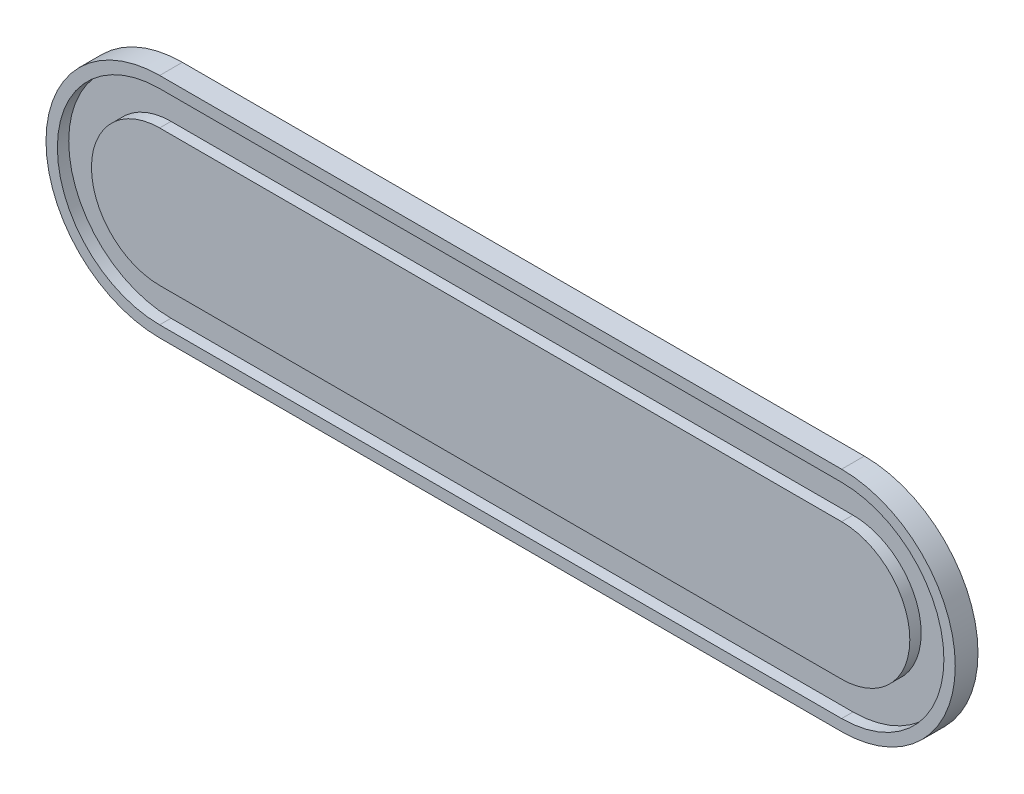
ISO-10303-21;
HEADER;
FILE_DESCRIPTION(('STEP AP214'),'2;1');
FILE_NAME('part.step','',(''),(''),'','','');
FILE_SCHEMA(('AUTOMOTIVE_DESIGN { 1 0 10303 214 1 1 1 1 }'));
ENDSEC;
DATA;
#1=APPLICATION_CONTEXT('core data for automotive mechanical design processes');
#2=APPLICATION_PROTOCOL_DEFINITION('international standard','automotive_design',2000,#1);
#3=PRODUCT_CONTEXT('',#1,'mechanical');
#4=PRODUCT('Part','Part','',(#3));
#5=PRODUCT_RELATED_PRODUCT_CATEGORY('part','',(#4));
#6=PRODUCT_DEFINITION_FORMATION('','',#4);
#7=PRODUCT_DEFINITION_CONTEXT('part definition',#1,'design');
#8=PRODUCT_DEFINITION('design','',#6,#7);
#9=PRODUCT_DEFINITION_SHAPE('','',#8);
#10=(LENGTH_UNIT() NAMED_UNIT(*) SI_UNIT(.MILLI.,.METRE.));
#11=(NAMED_UNIT(*) PLANE_ANGLE_UNIT() SI_UNIT($,.RADIAN.));
#12=(NAMED_UNIT(*) SI_UNIT($,.STERADIAN.) SOLID_ANGLE_UNIT());
#13=UNCERTAINTY_MEASURE_WITH_UNIT(LENGTH_MEASURE(1.E-05),#10,'distance_accuracy_value','');
#14=(GEOMETRIC_REPRESENTATION_CONTEXT(3) GLOBAL_UNCERTAINTY_ASSIGNED_CONTEXT((#13)) GLOBAL_UNIT_ASSIGNED_CONTEXT((#10,
#11,#12)) REPRESENTATION_CONTEXT('',''));
#15=CARTESIAN_POINT('',(0.,0.,0.));
#16=DIRECTION('',(0.,0.,1.));
#17=DIRECTION('',(1.,0.,0.));
#18=AXIS2_PLACEMENT_3D('',#15,#16,#17);
#19=CARTESIAN_POINT('',(0.,-10000.,1000.));
#20=DIRECTION('',(0.,1.,0.));
#21=DIRECTION('',(0.,0.,1.));
#22=AXIS2_PLACEMENT_3D('',#19,#20,#21);
#23=PLANE('',#22);
#24=DIRECTION('',(0.,0.,-1.));
#25=VECTOR('',#24,1.);
#26=CARTESIAN_POINT('',(1.56662131519275,-10000.,1000.));
#27=LINE('',#26,#25);
#28=CARTESIAN_POINT('',(1.56662131519275,-10000.,1000.));
#29=VERTEX_POINT('',#28);
#30=CARTESIAN_POINT('',(1.56662131519275,-10000.,-1000.));
#31=VERTEX_POINT('',#30);
#32=EDGE_CURVE('E170',#29,#31,#27,.T.);
#33=ORIENTED_EDGE('',*,*,#32,.T.);
#34=DIRECTION('',(1.,0.,0.));
#35=VECTOR('',#34,1.);
#36=CARTESIAN_POINT('',(0.,-10000.,-1000.));
#37=LINE('',#36,#35);
#38=CARTESIAN_POINT('',(60001.5666213152,-10000.,-1000.));
#39=VERTEX_POINT('',#38);
#40=EDGE_CURVE('E208',#31,#39,#37,.T.);
#41=ORIENTED_EDGE('',*,*,#40,.T.);
#42=DIRECTION('',(0.,0.,-1.));
#43=VECTOR('',#42,1.);
#44=CARTESIAN_POINT('',(60001.5666213152,-10000.,1000.));
#45=LINE('',#44,#43);
#46=CARTESIAN_POINT('',(60001.5666213152,-10000.,1000.));
#47=VERTEX_POINT('',#46);
#48=EDGE_CURVE('E12',#47,#39,#45,.T.);
#49=ORIENTED_EDGE('',*,*,#48,.F.);
#50=DIRECTION('',(1.,0.,0.));
#51=VECTOR('',#50,1.);
#52=CARTESIAN_POINT('',(0.,-10000.,1000.));
#53=LINE('',#52,#51);
#54=EDGE_CURVE('E136',#29,#47,#53,.T.);
#55=ORIENTED_EDGE('',*,*,#54,.F.);
#56=EDGE_LOOP('',(#33,#41,#49,#55));
#57=FACE_BOUND('',#56,.T.);
#58=ADVANCED_FACE('F63',(#57),#23,.F.);
#59=CARTESIAN_POINT('',(60001.5666213152,0.,1000.));
#60=DIRECTION('',(0.,0.,-1.));
#61=DIRECTION('',(-1.,0.,0.));
#62=AXIS2_PLACEMENT_3D('',#59,#60,#61);
#63=CYLINDRICAL_SURFACE('',#62,10000.);
#64=ORIENTED_EDGE('',*,*,#48,.T.);
#65=CARTESIAN_POINT('',(60001.5666213152,0.,-1000.));
#66=DIRECTION('',(0.,0.,1.));
#67=DIRECTION('',(1.,0.,0.));
#68=AXIS2_PLACEMENT_3D('',#65,#66,#67);
#69=CIRCLE('',#68,10000.);
#70=CARTESIAN_POINT('',(60001.5666213152,10000.,-1000.));
#71=VERTEX_POINT('',#70);
#72=EDGE_CURVE('E145',#39,#71,#69,.T.);
#73=ORIENTED_EDGE('',*,*,#72,.T.);
#74=DIRECTION('',(0.,0.,-1.));
#75=VECTOR('',#74,1.);
#76=CARTESIAN_POINT('',(60001.5666213152,10000.,1000.));
#77=LINE('',#76,#75);
#78=CARTESIAN_POINT('',(60001.5666213152,10000.,1000.));
#79=VERTEX_POINT('',#78);
#80=EDGE_CURVE('E72',#79,#71,#77,.T.);
#81=ORIENTED_EDGE('',*,*,#80,.F.);
#82=CARTESIAN_POINT('',(60001.5666213152,0.,1000.));
#83=DIRECTION('',(0.,0.,1.));
#84=DIRECTION('',(1.,0.,0.));
#85=AXIS2_PLACEMENT_3D('',#82,#83,#84);
#86=CIRCLE('',#85,10000.);
#87=EDGE_CURVE('E130',#47,#79,#86,.T.);
#88=ORIENTED_EDGE('',*,*,#87,.F.);
#89=EDGE_LOOP('',(#64,#73,#81,#88));
#90=FACE_BOUND('',#89,.T.);
#91=ADVANCED_FACE('F142',(#90),#63,.T.);
#92=CARTESIAN_POINT('',(0.,10000.,1000.));
#93=DIRECTION('',(0.,1.,0.));
#94=DIRECTION('',(0.,0.,1.));
#95=AXIS2_PLACEMENT_3D('',#92,#93,#94);
#96=PLANE('',#95);
#97=ORIENTED_EDGE('',*,*,#80,.T.);
#98=DIRECTION('',(1.,0.,0.));
#99=VECTOR('',#98,1.);
#100=CARTESIAN_POINT('',(0.,10000.,-1000.));
#101=LINE('',#100,#99);
#102=CARTESIAN_POINT('',(1.56662131519275,10000.,-1000.));
#103=VERTEX_POINT('',#102);
#104=EDGE_CURVE('E205',#103,#71,#101,.T.);
#105=ORIENTED_EDGE('',*,*,#104,.F.);
#106=DIRECTION('',(0.,0.,-1.));
#107=VECTOR('',#106,1.);
#108=CARTESIAN_POINT('',(1.56662131519275,10000.,1000.));
#109=LINE('',#108,#107);
#110=CARTESIAN_POINT('',(1.56662131519275,10000.,1000.));
#111=VERTEX_POINT('',#110);
#112=EDGE_CURVE('E149',#111,#103,#109,.T.);
#113=ORIENTED_EDGE('',*,*,#112,.F.);
#114=DIRECTION('',(1.,0.,0.));
#115=VECTOR('',#114,1.);
#116=CARTESIAN_POINT('',(0.,10000.,1000.));
#117=LINE('',#116,#115);
#118=EDGE_CURVE('E134',#111,#79,#117,.T.);
#119=ORIENTED_EDGE('',*,*,#118,.T.);
#120=EDGE_LOOP('',(#97,#105,#113,#119));
#121=FACE_BOUND('',#120,.T.);
#122=ADVANCED_FACE('F151',(#121),#96,.T.);
#123=CARTESIAN_POINT('',(60001.5666213152,0.,1000.));
#124=DIRECTION('',(0.,0.,-1.));
#125=DIRECTION('',(-1.,0.,0.));
#126=AXIS2_PLACEMENT_3D('',#123,#124,#125);
#127=CYLINDRICAL_SURFACE('',#126,9000.);
#128=CARTESIAN_POINT('',(60001.5666213152,0.,0.));
#129=DIRECTION('',(0.,0.,1.));
#130=DIRECTION('',(1.,0.,0.));
#131=AXIS2_PLACEMENT_3D('',#128,#129,#130);
#132=CIRCLE('',#131,9000.);
#133=CARTESIAN_POINT('',(60001.5666213152,-9000.,0.));
#134=VERTEX_POINT('',#133);
#135=CARTESIAN_POINT('',(60001.5666213152,9000.,0.));
#136=VERTEX_POINT('',#135);
#137=EDGE_CURVE('E157',#134,#136,#132,.T.);
#138=ORIENTED_EDGE('',*,*,#137,.F.);
#139=DIRECTION('',(0.,0.,-1.));
#140=VECTOR('',#139,1.);
#141=CARTESIAN_POINT('',(60001.5666213152,-9000.,1000.));
#142=LINE('',#141,#140);
#143=CARTESIAN_POINT('',(60001.5666213152,-9000.,1000.));
#144=VERTEX_POINT('',#143);
#145=EDGE_CURVE('E67',#144,#134,#142,.T.);
#146=ORIENTED_EDGE('',*,*,#145,.F.);
#147=CARTESIAN_POINT('',(60001.5666213152,0.,1000.));
#148=DIRECTION('',(0.,0.,1.));
#149=DIRECTION('',(1.,0.,0.));
#150=AXIS2_PLACEMENT_3D('',#147,#148,#149);
#151=CIRCLE('',#150,9000.);
#152=CARTESIAN_POINT('',(60001.5666213152,9000.,1000.));
#153=VERTEX_POINT('',#152);
#154=EDGE_CURVE('E169',#144,#153,#151,.T.);
#155=ORIENTED_EDGE('',*,*,#154,.T.);
#156=DIRECTION('',(0.,0.,-1.));
#157=VECTOR('',#156,1.);
#158=CARTESIAN_POINT('',(60001.5666213152,9000.,1000.));
#159=LINE('',#158,#157);
#160=EDGE_CURVE('E109',#153,#136,#159,.T.);
#161=ORIENTED_EDGE('',*,*,#160,.T.);
#162=EDGE_LOOP('',(#138,#146,#155,#161));
#163=FACE_BOUND('',#162,.T.);
#164=ADVANCED_FACE('F65',(#163),#127,.F.);
#165=CARTESIAN_POINT('',(0.,-9000.,1000.));
#166=DIRECTION('',(0.,1.,0.));
#167=DIRECTION('',(0.,0.,1.));
#168=AXIS2_PLACEMENT_3D('',#165,#166,#167);
#169=PLANE('',#168);
#170=DIRECTION('',(1.,0.,0.));
#171=VECTOR('',#170,1.);
#172=CARTESIAN_POINT('',(0.,-9000.,0.));
#173=LINE('',#172,#171);
#174=CARTESIAN_POINT('',(1.56662131519275,-9000.,0.));
#175=VERTEX_POINT('',#174);
#176=EDGE_CURVE('E160',#175,#134,#173,.T.);
#177=ORIENTED_EDGE('',*,*,#176,.F.);
#178=DIRECTION('',(0.,0.,-1.));
#179=VECTOR('',#178,1.);
#180=CARTESIAN_POINT('',(1.56662131519275,-9000.,1000.));
#181=LINE('',#180,#179);
#182=CARTESIAN_POINT('',(1.56662131519275,-9000.,1000.));
#183=VERTEX_POINT('',#182);
#184=EDGE_CURVE('E176',#183,#175,#181,.T.);
#185=ORIENTED_EDGE('',*,*,#184,.F.);
#186=DIRECTION('',(1.,0.,0.));
#187=VECTOR('',#186,1.);
#188=CARTESIAN_POINT('',(0.,-9000.,1000.));
#189=LINE('',#188,#187);
#190=EDGE_CURVE('E185',#183,#144,#189,.T.);
#191=ORIENTED_EDGE('',*,*,#190,.T.);
#192=ORIENTED_EDGE('',*,*,#145,.T.);
#193=EDGE_LOOP('',(#177,#185,#191,#192));
#194=FACE_BOUND('',#193,.T.);
#195=ADVANCED_FACE('F183',(#194),#169,.T.);
#196=CARTESIAN_POINT('',(1.5666213151917,0.,1000.));
#197=DIRECTION('',(0.,0.,-1.));
#198=DIRECTION('',(-1.,0.,0.));
#199=AXIS2_PLACEMENT_3D('',#196,#197,#198);
#200=CYLINDRICAL_SURFACE('',#199,9000.);
#201=CARTESIAN_POINT('',(1.5666213151917,0.,0.));
#202=DIRECTION('',(0.,0.,1.));
#203=DIRECTION('',(1.,0.,0.));
#204=AXIS2_PLACEMENT_3D('',#201,#202,#203);
#205=CIRCLE('',#204,9000.);
#206=CARTESIAN_POINT('',(1.56662131519275,9000.,0.));
#207=VERTEX_POINT('',#206);
#208=EDGE_CURVE('E164',#207,#175,#205,.T.);
#209=ORIENTED_EDGE('',*,*,#208,.F.);
#210=DIRECTION('',(0.,0.,-1.));
#211=VECTOR('',#210,1.);
#212=CARTESIAN_POINT('',(1.56662131519275,9000.,1000.));
#213=LINE('',#212,#211);
#214=CARTESIAN_POINT('',(1.56662131519275,9000.,1000.));
#215=VERTEX_POINT('',#214);
#216=EDGE_CURVE('E175',#215,#207,#213,.T.);
#217=ORIENTED_EDGE('',*,*,#216,.F.);
#218=CARTESIAN_POINT('',(1.5666213151917,0.,1000.));
#219=DIRECTION('',(0.,0.,1.));
#220=DIRECTION('',(1.,0.,0.));
#221=AXIS2_PLACEMENT_3D('',#218,#219,#220);
#222=CIRCLE('',#221,9000.);
#223=EDGE_CURVE('E193',#215,#183,#222,.T.);
#224=ORIENTED_EDGE('',*,*,#223,.T.);
#225=ORIENTED_EDGE('',*,*,#184,.T.);
#226=EDGE_LOOP('',(#209,#217,#224,#225));
#227=FACE_BOUND('',#226,.T.);
#228=ADVANCED_FACE('F190',(#227),#200,.F.);
#229=CARTESIAN_POINT('',(0.,9000.,1000.));
#230=DIRECTION('',(0.,1.,0.));
#231=DIRECTION('',(0.,0.,1.));
#232=AXIS2_PLACEMENT_3D('',#229,#230,#231);
#233=PLANE('',#232);
#234=DIRECTION('',(1.,0.,0.));
#235=VECTOR('',#234,1.);
#236=CARTESIAN_POINT('',(0.,9000.,0.));
#237=LINE('',#236,#235);
#238=EDGE_CURVE('E167',#207,#136,#237,.T.);
#239=ORIENTED_EDGE('',*,*,#238,.T.);
#240=ORIENTED_EDGE('',*,*,#160,.F.);
#241=DIRECTION('',(1.,0.,0.));
#242=VECTOR('',#241,1.);
#243=CARTESIAN_POINT('',(0.,9000.,1000.));
#244=LINE('',#243,#242);
#245=EDGE_CURVE('E195',#215,#153,#244,.T.);
#246=ORIENTED_EDGE('',*,*,#245,.F.);
#247=ORIENTED_EDGE('',*,*,#216,.T.);
#248=EDGE_LOOP('',(#239,#240,#246,#247));
#249=FACE_BOUND('',#248,.T.);
#250=ADVANCED_FACE('F196',(#249),#233,.F.);
#251=CARTESIAN_POINT('',(1.56662131519275,0.,1000.));
#252=DIRECTION('',(0.,0.,-1.));
#253=DIRECTION('',(-1.,0.,0.));
#254=AXIS2_PLACEMENT_3D('',#251,#252,#253);
#255=CYLINDRICAL_SURFACE('',#254,10000.);
#256=ORIENTED_EDGE('',*,*,#112,.T.);
#257=CARTESIAN_POINT('',(1.56662131519275,0.,-1000.));
#258=DIRECTION('',(0.,0.,1.));
#259=DIRECTION('',(1.,0.,0.));
#260=AXIS2_PLACEMENT_3D('',#257,#258,#259);
#261=CIRCLE('',#260,10000.);
#262=EDGE_CURVE('E161',#103,#31,#261,.T.);
#263=ORIENTED_EDGE('',*,*,#262,.T.);
#264=ORIENTED_EDGE('',*,*,#32,.F.);
#265=CARTESIAN_POINT('',(1.56662131519275,0.,1000.));
#266=DIRECTION('',(0.,0.,1.));
#267=DIRECTION('',(1.,0.,0.));
#268=AXIS2_PLACEMENT_3D('',#265,#266,#267);
#269=CIRCLE('',#268,10000.);
#270=EDGE_CURVE('E89',#111,#29,#269,.T.);
#271=ORIENTED_EDGE('',*,*,#270,.F.);
#272=EDGE_LOOP('',(#256,#263,#264,#271));
#273=FACE_BOUND('',#272,.T.);
#274=ADVANCED_FACE('F280',(#273),#255,.T.);
#275=CARTESIAN_POINT('',(0.,0.,1000.));
#276=DIRECTION('',(0.,0.,1.));
#277=DIRECTION('',(1.,0.,0.));
#278=AXIS2_PLACEMENT_3D('',#275,#276,#277);
#279=PLANE('',#278);
#280=ORIENTED_EDGE('',*,*,#154,.F.);
#281=ORIENTED_EDGE('',*,*,#190,.F.);
#282=ORIENTED_EDGE('',*,*,#223,.F.);
#283=ORIENTED_EDGE('',*,*,#245,.T.);
#284=EDGE_LOOP('',(#280,#281,#282,#283));
#285=FACE_BOUND('',#284,.T.);
#286=ORIENTED_EDGE('',*,*,#54,.T.);
#287=ORIENTED_EDGE('',*,*,#87,.T.);
#288=ORIENTED_EDGE('',*,*,#118,.F.);
#289=ORIENTED_EDGE('',*,*,#270,.T.);
#290=EDGE_LOOP('',(#286,#287,#288,#289));
#291=FACE_BOUND('',#290,.T.);
#292=ADVANCED_FACE('F132',(#285,#291),#279,.T.);
#293=CARTESIAN_POINT('',(0.,0.,0.));
#294=DIRECTION('',(0.,0.,1.));
#295=DIRECTION('',(1.,0.,0.));
#296=AXIS2_PLACEMENT_3D('',#293,#294,#295);
#297=PLANE('',#296);
#298=CARTESIAN_POINT('',(60001.5666213152,0.,0.));
#299=DIRECTION('',(0.,0.,1.));
#300=DIRECTION('',(1.,0.,0.));
#301=AXIS2_PLACEMENT_3D('',#298,#299,#300);
#302=CIRCLE('',#301,6000.);
#303=CARTESIAN_POINT('',(60001.5666213152,-6000.,0.));
#304=VERTEX_POINT('',#303);
#305=CARTESIAN_POINT('',(60001.5666213152,6000.,0.));
#306=VERTEX_POINT('',#305);
#307=EDGE_CURVE('E227',#304,#306,#302,.T.);
#308=ORIENTED_EDGE('',*,*,#307,.F.);
#309=DIRECTION('',(1.,0.,0.));
#310=VECTOR('',#309,1.);
#311=CARTESIAN_POINT('',(0.,-6000.,0.));
#312=LINE('',#311,#310);
#313=CARTESIAN_POINT('',(1.56662131519275,-6000.,0.));
#314=VERTEX_POINT('',#313);
#315=EDGE_CURVE('E230',#314,#304,#312,.T.);
#316=ORIENTED_EDGE('',*,*,#315,.F.);
#317=CARTESIAN_POINT('',(1.5666213151917,0.,0.));
#318=DIRECTION('',(0.,0.,1.));
#319=DIRECTION('',(1.,0.,0.));
#320=AXIS2_PLACEMENT_3D('',#317,#318,#319);
#321=CIRCLE('',#320,6000.);
#322=CARTESIAN_POINT('',(1.56662131519275,6000.,0.));
#323=VERTEX_POINT('',#322);
#324=EDGE_CURVE('E222',#323,#314,#321,.T.);
#325=ORIENTED_EDGE('',*,*,#324,.F.);
#326=DIRECTION('',(1.,0.,0.));
#327=VECTOR('',#326,1.);
#328=CARTESIAN_POINT('',(0.,6000.,0.));
#329=LINE('',#328,#327);
#330=EDGE_CURVE('E80',#323,#306,#329,.T.);
#331=ORIENTED_EDGE('',*,*,#330,.T.);
#332=EDGE_LOOP('',(#308,#316,#325,#331));
#333=FACE_BOUND('',#332,.T.);
#334=ORIENTED_EDGE('',*,*,#176,.T.);
#335=ORIENTED_EDGE('',*,*,#137,.T.);
#336=ORIENTED_EDGE('',*,*,#238,.F.);
#337=ORIENTED_EDGE('',*,*,#208,.T.);
#338=EDGE_LOOP('',(#334,#335,#336,#337));
#339=FACE_BOUND('',#338,.T.);
#340=ADVANCED_FACE('F188',(#333,#339),#297,.T.);
#341=CARTESIAN_POINT('',(0.,0.,-1000.));
#342=DIRECTION('',(0.,0.,1.));
#343=DIRECTION('',(1.,0.,0.));
#344=AXIS2_PLACEMENT_3D('',#341,#342,#343);
#345=PLANE('',#344);
#346=ORIENTED_EDGE('',*,*,#40,.F.);
#347=ORIENTED_EDGE('',*,*,#262,.F.);
#348=ORIENTED_EDGE('',*,*,#104,.T.);
#349=ORIENTED_EDGE('',*,*,#72,.F.);
#350=EDGE_LOOP('',(#346,#347,#348,#349));
#351=FACE_BOUND('',#350,.T.);
#352=ADVANCED_FACE('F279',(#351),#345,.F.);
#353=CARTESIAN_POINT('',(0.,-6000.,1000.));
#354=DIRECTION('',(0.,1.,0.));
#355=DIRECTION('',(0.,0.,1.));
#356=AXIS2_PLACEMENT_3D('',#353,#354,#355);
#357=PLANE('',#356);
#358=ORIENTED_EDGE('',*,*,#315,.T.);
#359=DIRECTION('',(0.,0.,-1.));
#360=VECTOR('',#359,1.);
#361=CARTESIAN_POINT('',(60001.5666213152,-6000.,1000.));
#362=LINE('',#361,#360);
#363=CARTESIAN_POINT('',(60001.5666213152,-6000.,1000.));
#364=VERTEX_POINT('',#363);
#365=EDGE_CURVE('E211',#364,#304,#362,.T.);
#366=ORIENTED_EDGE('',*,*,#365,.F.);
#367=DIRECTION('',(1.,0.,0.));
#368=VECTOR('',#367,1.);
#369=CARTESIAN_POINT('',(0.,-6000.,1000.));
#370=LINE('',#369,#368);
#371=CARTESIAN_POINT('',(1.56662131519275,-6000.,1000.));
#372=VERTEX_POINT('',#371);
#373=EDGE_CURVE('E225',#372,#364,#370,.T.);
#374=ORIENTED_EDGE('',*,*,#373,.F.);
#375=DIRECTION('',(0.,0.,-1.));
#376=VECTOR('',#375,1.);
#377=CARTESIAN_POINT('',(1.56662131519275,-6000.,1000.));
#378=LINE('',#377,#376);
#379=EDGE_CURVE('E218',#372,#314,#378,.T.);
#380=ORIENTED_EDGE('',*,*,#379,.T.);
#381=EDGE_LOOP('',(#358,#366,#374,#380));
#382=FACE_BOUND('',#381,.T.);
#383=ADVANCED_FACE('F257',(#382),#357,.F.);
#384=CARTESIAN_POINT('',(60001.5666213152,0.,1000.));
#385=DIRECTION('',(0.,0.,-1.));
#386=DIRECTION('',(-1.,0.,0.));
#387=AXIS2_PLACEMENT_3D('',#384,#385,#386);
#388=CYLINDRICAL_SURFACE('',#387,6000.);
#389=ORIENTED_EDGE('',*,*,#307,.T.);
#390=DIRECTION('',(0.,0.,-1.));
#391=VECTOR('',#390,1.);
#392=CARTESIAN_POINT('',(60001.5666213152,6000.,1000.));
#393=LINE('',#392,#391);
#394=CARTESIAN_POINT('',(60001.5666213152,6000.,1000.));
#395=VERTEX_POINT('',#394);
#396=EDGE_CURVE('E214',#395,#306,#393,.T.);
#397=ORIENTED_EDGE('',*,*,#396,.F.);
#398=CARTESIAN_POINT('',(60001.5666213152,0.,1000.));
#399=DIRECTION('',(0.,0.,1.));
#400=DIRECTION('',(1.,0.,0.));
#401=AXIS2_PLACEMENT_3D('',#398,#399,#400);
#402=CIRCLE('',#401,6000.);
#403=EDGE_CURVE('E238',#364,#395,#402,.T.);
#404=ORIENTED_EDGE('',*,*,#403,.F.);
#405=ORIENTED_EDGE('',*,*,#365,.T.);
#406=EDGE_LOOP('',(#389,#397,#404,#405));
#407=FACE_BOUND('',#406,.T.);
#408=ADVANCED_FACE('F262',(#407),#388,.T.);
#409=CARTESIAN_POINT('',(0.,6000.,1000.));
#410=DIRECTION('',(0.,1.,0.));
#411=DIRECTION('',(0.,0.,1.));
#412=AXIS2_PLACEMENT_3D('',#409,#410,#411);
#413=PLANE('',#412);
#414=ORIENTED_EDGE('',*,*,#330,.F.);
#415=DIRECTION('',(0.,0.,-1.));
#416=VECTOR('',#415,1.);
#417=CARTESIAN_POINT('',(1.56662131519275,6000.,1000.));
#418=LINE('',#417,#416);
#419=CARTESIAN_POINT('',(1.56662131519275,6000.,1000.));
#420=VERTEX_POINT('',#419);
#421=EDGE_CURVE('E216',#420,#323,#418,.T.);
#422=ORIENTED_EDGE('',*,*,#421,.F.);
#423=DIRECTION('',(1.,0.,0.));
#424=VECTOR('',#423,1.);
#425=CARTESIAN_POINT('',(0.,6000.,1000.));
#426=LINE('',#425,#424);
#427=EDGE_CURVE('E235',#420,#395,#426,.T.);
#428=ORIENTED_EDGE('',*,*,#427,.T.);
#429=ORIENTED_EDGE('',*,*,#396,.T.);
#430=EDGE_LOOP('',(#414,#422,#428,#429));
#431=FACE_BOUND('',#430,.T.);
#432=ADVANCED_FACE('F354',(#431),#413,.T.);
#433=CARTESIAN_POINT('',(1.5666213151917,0.,1000.));
#434=DIRECTION('',(0.,0.,-1.));
#435=DIRECTION('',(-1.,0.,0.));
#436=AXIS2_PLACEMENT_3D('',#433,#434,#435);
#437=CYLINDRICAL_SURFACE('',#436,6000.);
#438=ORIENTED_EDGE('',*,*,#324,.T.);
#439=ORIENTED_EDGE('',*,*,#379,.F.);
#440=CARTESIAN_POINT('',(1.5666213151917,0.,1000.));
#441=DIRECTION('',(0.,0.,1.));
#442=DIRECTION('',(1.,0.,0.));
#443=AXIS2_PLACEMENT_3D('',#440,#441,#442);
#444=CIRCLE('',#443,6000.);
#445=EDGE_CURVE('E221',#420,#372,#444,.T.);
#446=ORIENTED_EDGE('',*,*,#445,.F.);
#447=ORIENTED_EDGE('',*,*,#421,.T.);
#448=EDGE_LOOP('',(#438,#439,#446,#447));
#449=FACE_BOUND('',#448,.T.);
#450=ADVANCED_FACE('F361',(#449),#437,.T.);
#451=CARTESIAN_POINT('',(0.,0.,1000.));
#452=DIRECTION('',(0.,0.,1.));
#453=DIRECTION('',(1.,0.,0.));
#454=AXIS2_PLACEMENT_3D('',#451,#452,#453);
#455=PLANE('',#454);
#456=ORIENTED_EDGE('',*,*,#373,.T.);
#457=ORIENTED_EDGE('',*,*,#403,.T.);
#458=ORIENTED_EDGE('',*,*,#427,.F.);
#459=ORIENTED_EDGE('',*,*,#445,.T.);
#460=EDGE_LOOP('',(#456,#457,#458,#459));
#461=FACE_BOUND('',#460,.T.);
#462=ADVANCED_FACE('F246',(#461),#455,.T.);
#463=CLOSED_SHELL('',(#58,#91,#122,#164,#195,#228,#250,#274,#292,#340,#352,#383,#408,#432,#450,#462));
#464=MANIFOLD_SOLID_BREP('B2',#463);
#465=ADVANCED_BREP_SHAPE_REPRESENTATION('',(#18,#464),#14);
#466=SHAPE_DEFINITION_REPRESENTATION(#9,#465);
ENDSEC;
END-ISO-10303-21;
